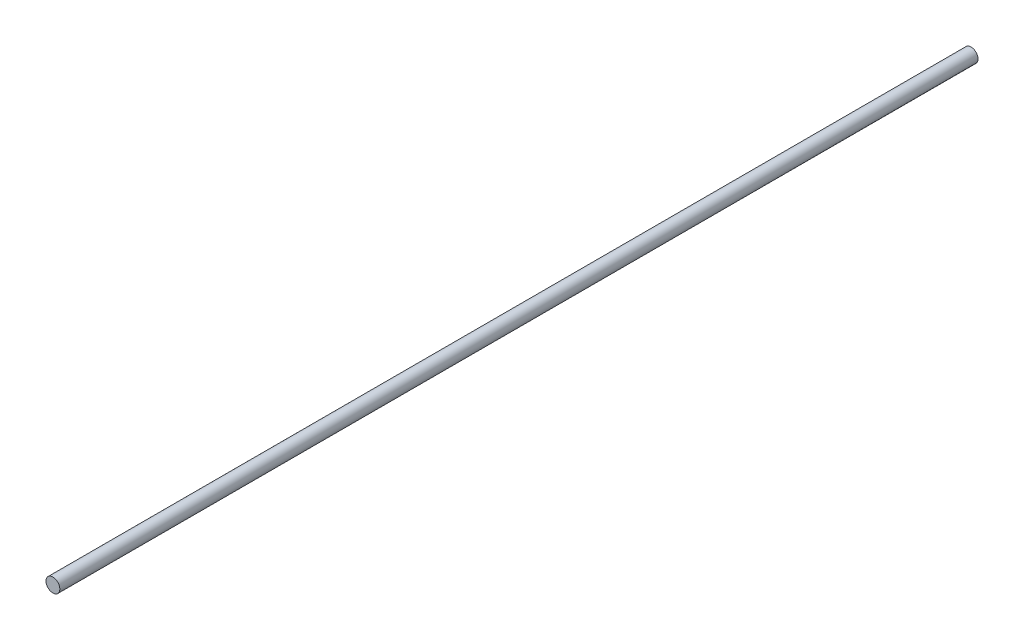
ISO-10303-21;
HEADER;
FILE_DESCRIPTION(('STEP AP214'),'2;1');
FILE_NAME('part.step','',(''),(''),'','','');
FILE_SCHEMA(('AUTOMOTIVE_DESIGN { 1 0 10303 214 1 1 1 1 }'));
ENDSEC;
DATA;
#1=APPLICATION_CONTEXT('core data for automotive mechanical design processes');
#2=APPLICATION_PROTOCOL_DEFINITION('international standard','automotive_design',2000,#1);
#3=PRODUCT_CONTEXT('',#1,'mechanical');
#4=PRODUCT('Part','Part','',(#3));
#5=PRODUCT_RELATED_PRODUCT_CATEGORY('part','',(#4));
#6=PRODUCT_DEFINITION_FORMATION('','',#4);
#7=PRODUCT_DEFINITION_CONTEXT('part definition',#1,'design');
#8=PRODUCT_DEFINITION('design','',#6,#7);
#9=PRODUCT_DEFINITION_SHAPE('','',#8);
#10=(LENGTH_UNIT() NAMED_UNIT(*) SI_UNIT(.MILLI.,.METRE.));
#11=(NAMED_UNIT(*) PLANE_ANGLE_UNIT() SI_UNIT($,.RADIAN.));
#12=(NAMED_UNIT(*) SI_UNIT($,.STERADIAN.) SOLID_ANGLE_UNIT());
#13=UNCERTAINTY_MEASURE_WITH_UNIT(LENGTH_MEASURE(1.E-05),#10,'distance_accuracy_value','');
#14=(GEOMETRIC_REPRESENTATION_CONTEXT(3) GLOBAL_UNCERTAINTY_ASSIGNED_CONTEXT((#13)) GLOBAL_UNIT_ASSIGNED_CONTEXT((#10,
#11,#12)) REPRESENTATION_CONTEXT('',''));
#15=CARTESIAN_POINT('',(0.,0.,0.));
#16=DIRECTION('',(0.,0.,1.));
#17=DIRECTION('',(1.,0.,0.));
#18=AXIS2_PLACEMENT_3D('',#15,#16,#17);
#19=CARTESIAN_POINT('',(0.,0.,631.19));
#20=DIRECTION('',(0.,0.,-1.));
#21=DIRECTION('',(-1.,0.,0.));
#22=AXIS2_PLACEMENT_3D('',#19,#20,#21);
#23=CYLINDRICAL_SURFACE('',#22,4.7625);
#24=CARTESIAN_POINT('',(0.,0.,631.19));
#25=DIRECTION('',(0.,0.,1.));
#26=DIRECTION('',(1.,0.,0.));
#27=AXIS2_PLACEMENT_3D('',#24,#25,#26);
#28=CIRCLE('',#27,4.7625);
#29=CARTESIAN_POINT('',(4.7625,0.,631.19));
#30=VERTEX_POINT('',#29);
#31=EDGE_CURVE('E10',#30,#30,#28,.T.);
#32=ORIENTED_EDGE('',*,*,#31,.F.);
#33=EDGE_LOOP('',(#32));
#34=FACE_BOUND('',#33,.T.);
#35=CARTESIAN_POINT('',(0.,0.,0.));
#36=DIRECTION('',(0.,0.,1.));
#37=DIRECTION('',(1.,0.,0.));
#38=AXIS2_PLACEMENT_3D('',#35,#36,#37);
#39=CIRCLE('',#38,4.7625);
#40=CARTESIAN_POINT('',(4.7625,0.,0.));
#41=VERTEX_POINT('',#40);
#42=EDGE_CURVE('E48',#41,#41,#39,.T.);
#43=ORIENTED_EDGE('',*,*,#42,.T.);
#44=EDGE_LOOP('',(#43));
#45=FACE_BOUND('',#44,.T.);
#46=ADVANCED_FACE('F45',(#34,#45),#23,.T.);
#47=CARTESIAN_POINT('',(0.,0.,631.19));
#48=DIRECTION('',(0.,0.,1.));
#49=DIRECTION('',(1.,0.,0.));
#50=AXIS2_PLACEMENT_3D('',#47,#48,#49);
#51=PLANE('',#50);
#52=ORIENTED_EDGE('',*,*,#31,.T.);
#53=EDGE_LOOP('',(#52));
#54=FACE_BOUND('',#53,.T.);
#55=ADVANCED_FACE('F60',(#54),#51,.T.);
#56=CARTESIAN_POINT('',(0.,0.,0.));
#57=DIRECTION('',(0.,0.,1.));
#58=DIRECTION('',(1.,0.,0.));
#59=AXIS2_PLACEMENT_3D('',#56,#57,#58);
#60=PLANE('',#59);
#61=ORIENTED_EDGE('',*,*,#42,.F.);
#62=EDGE_LOOP('',(#61));
#63=FACE_BOUND('',#62,.T.);
#64=ADVANCED_FACE('F58',(#63),#60,.F.);
#65=CLOSED_SHELL('',(#46,#55,#64));
#66=MANIFOLD_SOLID_BREP('B2',#65);
#67=ADVANCED_BREP_SHAPE_REPRESENTATION('',(#18,#66),#14);
#68=SHAPE_DEFINITION_REPRESENTATION(#9,#67);
ENDSEC;
END-ISO-10303-21;
